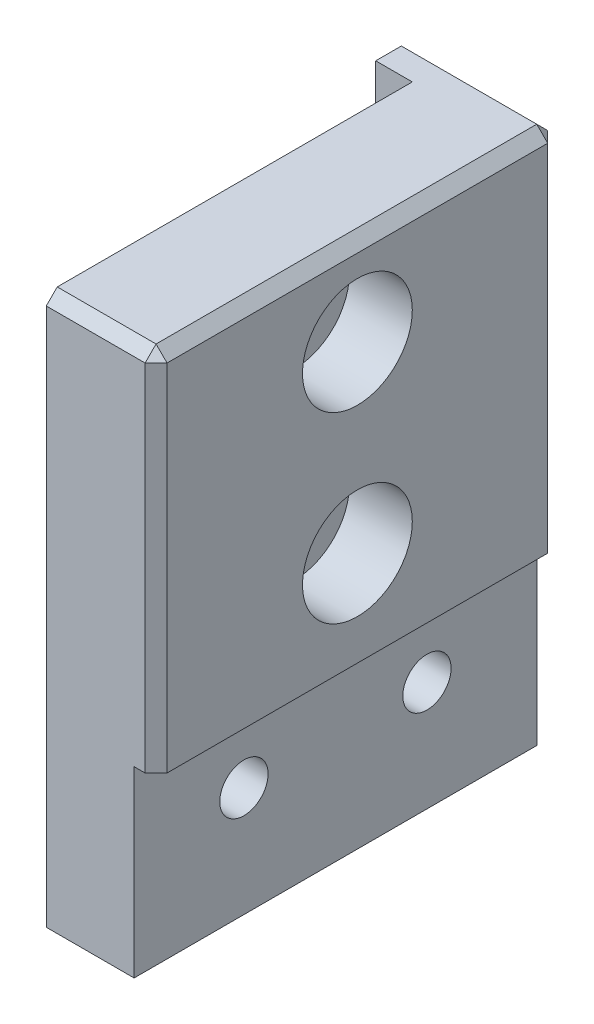
ISO-10303-21;
HEADER;
FILE_DESCRIPTION(('STEP AP214'),'2;1');
FILE_NAME('part.step','',(''),(''),'','','');
FILE_SCHEMA(('AUTOMOTIVE_DESIGN { 1 0 10303 214 1 1 1 1 }'));
ENDSEC;
DATA;
#1=APPLICATION_CONTEXT('core data for automotive mechanical design processes');
#2=APPLICATION_PROTOCOL_DEFINITION('international standard','automotive_design',2000,#1);
#3=PRODUCT_CONTEXT('',#1,'mechanical');
#4=PRODUCT('Part','Part','',(#3));
#5=PRODUCT_RELATED_PRODUCT_CATEGORY('part','',(#4));
#6=PRODUCT_DEFINITION_FORMATION('','',#4);
#7=PRODUCT_DEFINITION_CONTEXT('part definition',#1,'design');
#8=PRODUCT_DEFINITION('design','',#6,#7);
#9=PRODUCT_DEFINITION_SHAPE('','',#8);
#10=(LENGTH_UNIT() NAMED_UNIT(*) SI_UNIT(.MILLI.,.METRE.));
#11=(NAMED_UNIT(*) PLANE_ANGLE_UNIT() SI_UNIT($,.RADIAN.));
#12=(NAMED_UNIT(*) SI_UNIT($,.STERADIAN.) SOLID_ANGLE_UNIT());
#13=UNCERTAINTY_MEASURE_WITH_UNIT(LENGTH_MEASURE(1.E-05),#10,'distance_accuracy_value','');
#14=(GEOMETRIC_REPRESENTATION_CONTEXT(3) GLOBAL_UNCERTAINTY_ASSIGNED_CONTEXT((#13)) GLOBAL_UNIT_ASSIGNED_CONTEXT((#10,
#11,#12)) REPRESENTATION_CONTEXT('',''));
#15=CARTESIAN_POINT('',(0.,0.,0.));
#16=DIRECTION('',(0.,0.,1.));
#17=DIRECTION('',(1.,0.,0.));
#18=AXIS2_PLACEMENT_3D('',#15,#16,#17);
#19=CARTESIAN_POINT('',(0.,10.,40.));
#20=DIRECTION('',(-1.,0.,0.));
#21=DIRECTION('',(0.,0.,1.));
#22=AXIS2_PLACEMENT_3D('',#19,#20,#21);
#23=CYLINDRICAL_SURFACE('',#22,3.3);
#24=CARTESIAN_POINT('',(6.4,10.,40.));
#25=DIRECTION('',(-1.,0.,0.));
#26=DIRECTION('',(0.,0.,1.));
#27=AXIS2_PLACEMENT_3D('',#24,#25,#26);
#28=CIRCLE('',#27,3.3);
#29=CARTESIAN_POINT('',(6.4,10.,43.3));
#30=VERTEX_POINT('',#29);
#31=EDGE_CURVE('E301',#30,#30,#28,.T.);
#32=ORIENTED_EDGE('',*,*,#31,.T.);
#33=EDGE_LOOP('',(#32));
#34=FACE_BOUND('',#33,.T.);
#35=CARTESIAN_POINT('',(12.,10.,40.));
#36=DIRECTION('',(1.,0.,0.));
#37=DIRECTION('',(0.,0.,-1.));
#38=AXIS2_PLACEMENT_3D('',#35,#36,#37);
#39=CIRCLE('',#38,3.3);
#40=CARTESIAN_POINT('',(12.,10.,36.7));
#41=VERTEX_POINT('',#40);
#42=EDGE_CURVE('E183',#41,#41,#39,.F.);
#43=ORIENTED_EDGE('',*,*,#42,.F.);
#44=EDGE_LOOP('',(#43));
#45=FACE_BOUND('',#44,.T.);
#46=ADVANCED_FACE('F42',(#34,#45),#23,.F.);
#47=CARTESIAN_POINT('',(0.,10.,15.));
#48=DIRECTION('',(-1.,0.,0.));
#49=DIRECTION('',(0.,0.,1.));
#50=AXIS2_PLACEMENT_3D('',#47,#48,#49);
#51=CYLINDRICAL_SURFACE('',#50,3.3);
#52=CARTESIAN_POINT('',(6.4,10.,15.));
#53=DIRECTION('',(-1.,0.,0.));
#54=DIRECTION('',(0.,0.,1.));
#55=AXIS2_PLACEMENT_3D('',#52,#53,#54);
#56=CIRCLE('',#55,3.3);
#57=CARTESIAN_POINT('',(6.4,10.,18.3));
#58=VERTEX_POINT('',#57);
#59=EDGE_CURVE('E292',#58,#58,#56,.T.);
#60=ORIENTED_EDGE('',*,*,#59,.T.);
#61=EDGE_LOOP('',(#60));
#62=FACE_BOUND('',#61,.T.);
#63=CARTESIAN_POINT('',(12.,10.,15.));
#64=DIRECTION('',(1.,0.,0.));
#65=DIRECTION('',(0.,0.,-1.));
#66=AXIS2_PLACEMENT_3D('',#63,#64,#65);
#67=CIRCLE('',#66,3.3);
#68=CARTESIAN_POINT('',(12.,10.,11.7));
#69=VERTEX_POINT('',#68);
#70=EDGE_CURVE('E180',#69,#69,#67,.F.);
#71=ORIENTED_EDGE('',*,*,#70,.F.);
#72=EDGE_LOOP('',(#71));
#73=FACE_BOUND('',#72,.T.);
#74=ADVANCED_FACE('F326',(#62,#73),#51,.F.);
#75=CARTESIAN_POINT('',(0.,0.,55.));
#76=DIRECTION('',(1.,0.,0.));
#77=DIRECTION('',(0.,0.,-1.));
#78=AXIS2_PLACEMENT_3D('',#75,#76,#77);
#79=PLANE('',#78);
#80=CARTESIAN_POINT('',(0.,58.,27.5));
#81=DIRECTION('',(1.,0.,0.));
#82=DIRECTION('',(0.,0.,-1.));
#83=AXIS2_PLACEMENT_3D('',#80,#81,#82);
#84=CIRCLE('',#83,4.5);
#85=CARTESIAN_POINT('',(0.,58.,23.));
#86=VERTEX_POINT('',#85);
#87=EDGE_CURVE('E189',#86,#86,#84,.T.);
#88=ORIENTED_EDGE('',*,*,#87,.T.);
#89=EDGE_LOOP('',(#88));
#90=FACE_BOUND('',#89,.T.);
#91=CARTESIAN_POINT('',(0.,33.,27.5));
#92=DIRECTION('',(1.,0.,0.));
#93=DIRECTION('',(0.,0.,-1.));
#94=AXIS2_PLACEMENT_3D('',#91,#92,#93);
#95=CIRCLE('',#94,4.5);
#96=CARTESIAN_POINT('',(0.,33.,23.));
#97=VERTEX_POINT('',#96);
#98=EDGE_CURVE('E185',#97,#97,#95,.T.);
#99=ORIENTED_EDGE('',*,*,#98,.T.);
#100=EDGE_LOOP('',(#99));
#101=FACE_BOUND('',#100,.T.);
#102=CARTESIAN_POINT('',(0.,10.,15.));
#103=DIRECTION('',(-1.,0.,0.));
#104=DIRECTION('',(0.,0.,1.));
#105=AXIS2_PLACEMENT_3D('',#102,#103,#104);
#106=CIRCLE('',#105,5.5);
#107=CARTESIAN_POINT('',(0.,10.,20.5));
#108=VERTEX_POINT('',#107);
#109=EDGE_CURVE('E286',#108,#108,#106,.T.);
#110=ORIENTED_EDGE('',*,*,#109,.F.);
#111=EDGE_LOOP('',(#110));
#112=FACE_BOUND('',#111,.T.);
#113=CARTESIAN_POINT('',(0.,10.,40.));
#114=DIRECTION('',(-1.,0.,0.));
#115=DIRECTION('',(0.,0.,1.));
#116=AXIS2_PLACEMENT_3D('',#113,#114,#115);
#117=CIRCLE('',#116,5.5);
#118=CARTESIAN_POINT('',(0.,10.,45.5));
#119=VERTEX_POINT('',#118);
#120=EDGE_CURVE('E295',#119,#119,#117,.T.);
#121=ORIENTED_EDGE('',*,*,#120,.F.);
#122=EDGE_LOOP('',(#121));
#123=FACE_BOUND('',#122,.T.);
#124=DIRECTION('',(0.,-1.,0.));
#125=VECTOR('',#124,1.);
#126=CARTESIAN_POINT('',(0.,0.,55.));
#127=LINE('',#126,#125);
#128=CARTESIAN_POINT('',(0.,68.5,55.));
#129=VERTEX_POINT('',#128);
#130=CARTESIAN_POINT('',(0.,-5.,55.));
#131=VERTEX_POINT('',#130);
#132=EDGE_CURVE('E129',#129,#131,#127,.T.);
#133=ORIENTED_EDGE('',*,*,#132,.F.);
#134=DIRECTION('',(0.,-0.707106781186548,0.707106781186548));
#135=VECTOR('',#134,1.);
#136=CARTESIAN_POINT('',(0.,68.5,55.));
#137=LINE('',#136,#135);
#138=CARTESIAN_POINT('',(0.,70.,53.5));
#139=VERTEX_POINT('',#138);
#140=EDGE_CURVE('E11',#129,#139,#137,.F.);
#141=ORIENTED_EDGE('',*,*,#140,.T.);
#142=DIRECTION('',(0.,0.,-1.));
#143=VECTOR('',#142,1.);
#144=CARTESIAN_POINT('',(0.,70.,55.));
#145=LINE('',#144,#143);
#146=CARTESIAN_POINT('',(0.,70.,5.));
#147=VERTEX_POINT('',#146);
#148=EDGE_CURVE('E177',#139,#147,#145,.T.);
#149=ORIENTED_EDGE('',*,*,#148,.T.);
#150=DIRECTION('',(0.,1.,0.));
#151=VECTOR('',#150,1.);
#152=CARTESIAN_POINT('',(0.,70.,5.));
#153=LINE('',#152,#151);
#154=CARTESIAN_POINT('',(0.,-5.,5.));
#155=VERTEX_POINT('',#154);
#156=EDGE_CURVE('E143',#155,#147,#153,.T.);
#157=ORIENTED_EDGE('',*,*,#156,.F.);
#158=DIRECTION('',(0.,0.,-1.));
#159=VECTOR('',#158,1.);
#160=CARTESIAN_POINT('',(0.,-5.,50.));
#161=LINE('',#160,#159);
#162=EDGE_CURVE('E140',#131,#155,#161,.T.);
#163=ORIENTED_EDGE('',*,*,#162,.F.);
#164=EDGE_LOOP('',(#133,#141,#149,#157,#163));
#165=FACE_BOUND('',#164,.T.);
#166=ADVANCED_FACE('F141',(#90,#101,#112,#123,#165),#79,.F.);
#167=CARTESIAN_POINT('',(0.,70.,55.));
#168=DIRECTION('',(0.,-1.,0.));
#169=DIRECTION('',(0.,0.,-1.));
#170=AXIS2_PLACEMENT_3D('',#167,#168,#169);
#171=PLANE('',#170);
#172=DIRECTION('',(0.,0.,-1.));
#173=VECTOR('',#172,1.);
#174=CARTESIAN_POINT('',(13.5,70.,55.));
#175=LINE('',#174,#173);
#176=CARTESIAN_POINT('',(13.5,70.,53.5));
#177=VERTEX_POINT('',#176);
#178=CARTESIAN_POINT('',(13.5,70.,1.49999999999999));
#179=VERTEX_POINT('',#178);
#180=EDGE_CURVE('E195',#177,#179,#175,.T.);
#181=ORIENTED_EDGE('',*,*,#180,.T.);
#182=DIRECTION('',(-1.,0.,0.));
#183=VECTOR('',#182,1.);
#184=CARTESIAN_POINT('',(-5.,70.,1.49999999999999));
#185=LINE('',#184,#183);
#186=CARTESIAN_POINT('',(-5.,70.,1.49999999999999));
#187=VERTEX_POINT('',#186);
#188=EDGE_CURVE('E197',#179,#187,#185,.T.);
#189=ORIENTED_EDGE('',*,*,#188,.T.);
#190=DIRECTION('',(0.,0.,-1.));
#191=VECTOR('',#190,1.);
#192=CARTESIAN_POINT('',(-5.,70.,0.));
#193=LINE('',#192,#191);
#194=CARTESIAN_POINT('',(-5.,70.,5.));
#195=VERTEX_POINT('',#194);
#196=EDGE_CURVE('E170',#195,#187,#193,.T.);
#197=ORIENTED_EDGE('',*,*,#196,.F.);
#198=DIRECTION('',(1.,0.,0.));
#199=VECTOR('',#198,1.);
#200=CARTESIAN_POINT('',(-5.,70.,5.));
#201=LINE('',#200,#199);
#202=EDGE_CURVE('E173',#195,#147,#201,.T.);
#203=ORIENTED_EDGE('',*,*,#202,.T.);
#204=ORIENTED_EDGE('',*,*,#148,.F.);
#205=DIRECTION('',(1.,0.,0.));
#206=VECTOR('',#205,1.);
#207=CARTESIAN_POINT('',(0.,70.,53.5));
#208=LINE('',#207,#206);
#209=EDGE_CURVE('E179',#139,#177,#208,.T.);
#210=ORIENTED_EDGE('',*,*,#209,.T.);
#211=EDGE_LOOP('',(#181,#189,#197,#203,#204,#210));
#212=FACE_BOUND('',#211,.T.);
#213=ADVANCED_FACE('F247',(#212),#171,.F.);
#214=CARTESIAN_POINT('',(0.,0.,55.));
#215=DIRECTION('',(0.,0.,-1.));
#216=DIRECTION('',(-1.,0.,0.));
#217=AXIS2_PLACEMENT_3D('',#214,#215,#216);
#218=PLANE('',#217);
#219=DIRECTION('',(1.,0.,0.));
#220=VECTOR('',#219,1.);
#221=CARTESIAN_POINT('',(17.,20.,55.));
#222=LINE('',#221,#220);
#223=CARTESIAN_POINT('',(12.,20.,55.));
#224=VERTEX_POINT('',#223);
#225=CARTESIAN_POINT('',(13.5,20.,55.));
#226=VERTEX_POINT('',#225);
#227=EDGE_CURVE('E154',#224,#226,#222,.T.);
#228=ORIENTED_EDGE('',*,*,#227,.T.);
#229=DIRECTION('',(0.,1.,0.));
#230=VECTOR('',#229,1.);
#231=CARTESIAN_POINT('',(13.5,0.,55.));
#232=LINE('',#231,#230);
#233=CARTESIAN_POINT('',(13.5,68.5,55.));
#234=VERTEX_POINT('',#233);
#235=EDGE_CURVE('E52',#226,#234,#232,.T.);
#236=ORIENTED_EDGE('',*,*,#235,.T.);
#237=DIRECTION('',(-1.,0.,0.));
#238=VECTOR('',#237,1.);
#239=CARTESIAN_POINT('',(0.,68.5,55.));
#240=LINE('',#239,#238);
#241=EDGE_CURVE('E63',#234,#129,#240,.T.);
#242=ORIENTED_EDGE('',*,*,#241,.T.);
#243=ORIENTED_EDGE('',*,*,#132,.T.);
#244=DIRECTION('',(-1.,0.,0.));
#245=VECTOR('',#244,1.);
#246=CARTESIAN_POINT('',(20.,-5.,55.));
#247=LINE('',#246,#245);
#248=CARTESIAN_POINT('',(12.,-5.,55.));
#249=VERTEX_POINT('',#248);
#250=EDGE_CURVE('E134',#249,#131,#247,.T.);
#251=ORIENTED_EDGE('',*,*,#250,.F.);
#252=DIRECTION('',(0.,-1.,0.));
#253=VECTOR('',#252,1.);
#254=CARTESIAN_POINT('',(12.,20.,55.));
#255=LINE('',#254,#253);
#256=EDGE_CURVE('E271',#224,#249,#255,.T.);
#257=ORIENTED_EDGE('',*,*,#256,.F.);
#258=EDGE_LOOP('',(#228,#236,#242,#243,#251,#257));
#259=FACE_BOUND('',#258,.T.);
#260=ADVANCED_FACE('F131',(#259),#218,.F.);
#261=CARTESIAN_POINT('',(0.,0.,0.));
#262=DIRECTION('',(0.,0.,-1.));
#263=DIRECTION('',(-1.,0.,0.));
#264=AXIS2_PLACEMENT_3D('',#261,#262,#263);
#265=PLANE('',#264);
#266=DIRECTION('',(0.,-1.,0.));
#267=VECTOR('',#266,1.);
#268=CARTESIAN_POINT('',(-5.,70.,0.));
#269=LINE('',#268,#267);
#270=CARTESIAN_POINT('',(-5.,68.5,0.));
#271=VERTEX_POINT('',#270);
#272=CARTESIAN_POINT('',(-5.,-5.,0.));
#273=VERTEX_POINT('',#272);
#274=EDGE_CURVE('E166',#271,#273,#269,.T.);
#275=ORIENTED_EDGE('',*,*,#274,.F.);
#276=DIRECTION('',(1.,0.,0.));
#277=VECTOR('',#276,1.);
#278=CARTESIAN_POINT('',(15.,68.5,0.));
#279=LINE('',#278,#277);
#280=CARTESIAN_POINT('',(13.5,68.5,0.));
#281=VERTEX_POINT('',#280);
#282=EDGE_CURVE('E204',#271,#281,#279,.T.);
#283=ORIENTED_EDGE('',*,*,#282,.T.);
#284=DIRECTION('',(0.,-1.,0.));
#285=VECTOR('',#284,1.);
#286=CARTESIAN_POINT('',(13.5,20.,0.));
#287=LINE('',#286,#285);
#288=CARTESIAN_POINT('',(13.5,20.,0.));
#289=VERTEX_POINT('',#288);
#290=EDGE_CURVE('E202',#281,#289,#287,.T.);
#291=ORIENTED_EDGE('',*,*,#290,.T.);
#292=DIRECTION('',(1.,0.,0.));
#293=VECTOR('',#292,1.);
#294=CARTESIAN_POINT('',(17.,20.,0.));
#295=LINE('',#294,#293);
#296=CARTESIAN_POINT('',(12.,20.,0.));
#297=VERTEX_POINT('',#296);
#298=EDGE_CURVE('E156',#297,#289,#295,.T.);
#299=ORIENTED_EDGE('',*,*,#298,.F.);
#300=DIRECTION('',(0.,1.,0.));
#301=VECTOR('',#300,1.);
#302=CARTESIAN_POINT('',(12.,20.,0.));
#303=LINE('',#302,#301);
#304=CARTESIAN_POINT('',(12.,-5.,0.));
#305=VERTEX_POINT('',#304);
#306=EDGE_CURVE('E266',#305,#297,#303,.T.);
#307=ORIENTED_EDGE('',*,*,#306,.F.);
#308=DIRECTION('',(1.,0.,0.));
#309=VECTOR('',#308,1.);
#310=CARTESIAN_POINT('',(-5.,-5.,0.));
#311=LINE('',#310,#309);
#312=EDGE_CURVE('E164',#273,#305,#311,.T.);
#313=ORIENTED_EDGE('',*,*,#312,.F.);
#314=EDGE_LOOP('',(#275,#283,#291,#299,#307,#313));
#315=FACE_BOUND('',#314,.T.);
#316=ADVANCED_FACE('F263',(#315),#265,.T.);
#317=CARTESIAN_POINT('',(-5.,70.,5.));
#318=DIRECTION('',(0.,0.,-1.));
#319=DIRECTION('',(0.,1.,0.));
#320=AXIS2_PLACEMENT_3D('',#317,#318,#319);
#321=PLANE('',#320);
#322=ORIENTED_EDGE('',*,*,#156,.T.);
#323=ORIENTED_EDGE('',*,*,#202,.F.);
#324=DIRECTION('',(0.,1.,0.));
#325=VECTOR('',#324,1.);
#326=CARTESIAN_POINT('',(-5.,70.,5.));
#327=LINE('',#326,#325);
#328=CARTESIAN_POINT('',(-5.,-5.,5.));
#329=VERTEX_POINT('',#328);
#330=EDGE_CURVE('E168',#329,#195,#327,.T.);
#331=ORIENTED_EDGE('',*,*,#330,.F.);
#332=DIRECTION('',(-1.,0.,0.));
#333=VECTOR('',#332,1.);
#334=CARTESIAN_POINT('',(0.,-5.,5.));
#335=LINE('',#334,#333);
#336=EDGE_CURVE('E147',#155,#329,#335,.T.);
#337=ORIENTED_EDGE('',*,*,#336,.F.);
#338=EDGE_LOOP('',(#322,#323,#331,#337));
#339=FACE_BOUND('',#338,.T.);
#340=ADVANCED_FACE('F256',(#339),#321,.F.);
#341=CARTESIAN_POINT('',(-5.,0.,0.));
#342=DIRECTION('',(-1.,0.,0.));
#343=DIRECTION('',(0.,0.,1.));
#344=AXIS2_PLACEMENT_3D('',#341,#342,#343);
#345=PLANE('',#344);
#346=ORIENTED_EDGE('',*,*,#196,.T.);
#347=DIRECTION('',(0.,-0.707106781186548,-0.707106781186548));
#348=VECTOR('',#347,1.);
#349=CARTESIAN_POINT('',(-5.,34.25,-34.25));
#350=LINE('',#349,#348);
#351=EDGE_CURVE('E200',#187,#271,#350,.T.);
#352=ORIENTED_EDGE('',*,*,#351,.T.);
#353=ORIENTED_EDGE('',*,*,#274,.T.);
#354=DIRECTION('',(0.,0.,-1.));
#355=VECTOR('',#354,1.);
#356=CARTESIAN_POINT('',(-5.,-5.,5.));
#357=LINE('',#356,#355);
#358=EDGE_CURVE('E161',#329,#273,#357,.T.);
#359=ORIENTED_EDGE('',*,*,#358,.F.);
#360=ORIENTED_EDGE('',*,*,#330,.T.);
#361=EDGE_LOOP('',(#346,#352,#353,#359,#360));
#362=FACE_BOUND('',#361,.T.);
#363=ADVANCED_FACE('F258',(#362),#345,.T.);
#364=CARTESIAN_POINT('',(0.,-5.,0.));
#365=DIRECTION('',(0.,-1.,0.));
#366=DIRECTION('',(0.,0.,-1.));
#367=AXIS2_PLACEMENT_3D('',#364,#365,#366);
#368=PLANE('',#367);
#369=ORIENTED_EDGE('',*,*,#250,.T.);
#370=ORIENTED_EDGE('',*,*,#162,.T.);
#371=ORIENTED_EDGE('',*,*,#336,.T.);
#372=ORIENTED_EDGE('',*,*,#358,.T.);
#373=ORIENTED_EDGE('',*,*,#312,.T.);
#374=DIRECTION('',(0.,0.,1.));
#375=VECTOR('',#374,1.);
#376=CARTESIAN_POINT('',(12.,-5.,-155.));
#377=LINE('',#376,#375);
#378=EDGE_CURVE('E153',#305,#249,#377,.T.);
#379=ORIENTED_EDGE('',*,*,#378,.T.);
#380=EDGE_LOOP('',(#369,#370,#371,#372,#373,#379));
#381=FACE_BOUND('',#380,.T.);
#382=ADVANCED_FACE('F150',(#381),#368,.T.);
#383=CARTESIAN_POINT('',(17.,20.,55.));
#384=DIRECTION('',(0.,1.,0.));
#385=DIRECTION('',(0.,0.,1.));
#386=AXIS2_PLACEMENT_3D('',#383,#384,#385);
#387=PLANE('',#386);
#388=ORIENTED_EDGE('',*,*,#298,.T.);
#389=DIRECTION('',(0.707106781186548,0.,0.707106781186547));
#390=VECTOR('',#389,1.);
#391=CARTESIAN_POINT('',(15.,20.,1.49999999999999));
#392=LINE('',#391,#390);
#393=CARTESIAN_POINT('',(15.,20.,1.49999999999999));
#394=VERTEX_POINT('',#393);
#395=EDGE_CURVE('E214',#289,#394,#392,.T.);
#396=ORIENTED_EDGE('',*,*,#395,.T.);
#397=DIRECTION('',(0.,0.,1.));
#398=VECTOR('',#397,1.);
#399=CARTESIAN_POINT('',(15.,20.,55.));
#400=LINE('',#399,#398);
#401=CARTESIAN_POINT('',(15.,20.,53.5));
#402=VERTEX_POINT('',#401);
#403=EDGE_CURVE('E275',#394,#402,#400,.T.);
#404=ORIENTED_EDGE('',*,*,#403,.T.);
#405=DIRECTION('',(0.707106781186548,0.,-0.707106781186548));
#406=VECTOR('',#405,1.);
#407=CARTESIAN_POINT('',(13.5,20.,55.));
#408=LINE('',#407,#406);
#409=EDGE_CURVE('E212',#402,#226,#408,.F.);
#410=ORIENTED_EDGE('',*,*,#409,.T.);
#411=ORIENTED_EDGE('',*,*,#227,.F.);
#412=DIRECTION('',(0.,0.,1.));
#413=VECTOR('',#412,1.);
#414=CARTESIAN_POINT('',(12.,20.,55.));
#415=LINE('',#414,#413);
#416=EDGE_CURVE('E184',#297,#224,#415,.T.);
#417=ORIENTED_EDGE('',*,*,#416,.F.);
#418=EDGE_LOOP('',(#388,#396,#404,#410,#411,#417));
#419=FACE_BOUND('',#418,.T.);
#420=ADVANCED_FACE('F307',(#419),#387,.F.);
#421=CARTESIAN_POINT('',(6.4,13.3,40.));
#422=DIRECTION('',(1.,0.,0.));
#423=DIRECTION('',(0.,0.,-1.));
#424=AXIS2_PLACEMENT_3D('',#421,#422,#423);
#425=PLANE('',#424);
#426=ORIENTED_EDGE('',*,*,#31,.F.);
#427=EDGE_LOOP('',(#426));
#428=FACE_BOUND('',#427,.T.);
#429=CARTESIAN_POINT('',(6.4,10.,40.));
#430=DIRECTION('',(-1.,0.,0.));
#431=DIRECTION('',(0.,0.,1.));
#432=AXIS2_PLACEMENT_3D('',#429,#430,#431);
#433=CIRCLE('',#432,5.5);
#434=CARTESIAN_POINT('',(6.4,10.,45.5));
#435=VERTEX_POINT('',#434);
#436=EDGE_CURVE('E298',#435,#435,#433,.T.);
#437=ORIENTED_EDGE('',*,*,#436,.T.);
#438=EDGE_LOOP('',(#437));
#439=FACE_BOUND('',#438,.T.);
#440=ADVANCED_FACE('F336',(#428,#439),#425,.F.);
#441=CARTESIAN_POINT('',(0.,10.,40.));
#442=DIRECTION('',(-1.,0.,0.));
#443=DIRECTION('',(0.,0.,1.));
#444=AXIS2_PLACEMENT_3D('',#441,#442,#443);
#445=CYLINDRICAL_SURFACE('',#444,5.5);
#446=ORIENTED_EDGE('',*,*,#436,.F.);
#447=EDGE_LOOP('',(#446));
#448=FACE_BOUND('',#447,.T.);
#449=ORIENTED_EDGE('',*,*,#120,.T.);
#450=EDGE_LOOP('',(#449));
#451=FACE_BOUND('',#450,.T.);
#452=ADVANCED_FACE('F576',(#448,#451),#445,.F.);
#453=CARTESIAN_POINT('',(6.4,13.3,15.));
#454=DIRECTION('',(1.,0.,0.));
#455=DIRECTION('',(0.,0.,-1.));
#456=AXIS2_PLACEMENT_3D('',#453,#454,#455);
#457=PLANE('',#456);
#458=ORIENTED_EDGE('',*,*,#59,.F.);
#459=EDGE_LOOP('',(#458));
#460=FACE_BOUND('',#459,.T.);
#461=CARTESIAN_POINT('',(6.4,10.,15.));
#462=DIRECTION('',(-1.,0.,0.));
#463=DIRECTION('',(0.,0.,1.));
#464=AXIS2_PLACEMENT_3D('',#461,#462,#463);
#465=CIRCLE('',#464,5.5);
#466=CARTESIAN_POINT('',(6.4,10.,20.5));
#467=VERTEX_POINT('',#466);
#468=EDGE_CURVE('E289',#467,#467,#465,.T.);
#469=ORIENTED_EDGE('',*,*,#468,.T.);
#470=EDGE_LOOP('',(#469));
#471=FACE_BOUND('',#470,.T.);
#472=ADVANCED_FACE('F566',(#460,#471),#457,.F.);
#473=CARTESIAN_POINT('',(0.,10.,15.));
#474=DIRECTION('',(-1.,0.,0.));
#475=DIRECTION('',(0.,0.,1.));
#476=AXIS2_PLACEMENT_3D('',#473,#474,#475);
#477=CYLINDRICAL_SURFACE('',#476,5.5);
#478=ORIENTED_EDGE('',*,*,#468,.F.);
#479=EDGE_LOOP('',(#478));
#480=FACE_BOUND('',#479,.T.);
#481=ORIENTED_EDGE('',*,*,#109,.T.);
#482=EDGE_LOOP('',(#481));
#483=FACE_BOUND('',#482,.T.);
#484=ADVANCED_FACE('F498',(#480,#483),#477,.F.);
#485=CARTESIAN_POINT('',(12.,0.,0.));
#486=DIRECTION('',(1.,0.,0.));
#487=DIRECTION('',(0.,0.,-1.));
#488=AXIS2_PLACEMENT_3D('',#485,#486,#487);
#489=PLANE('',#488);
#490=ORIENTED_EDGE('',*,*,#256,.T.);
#491=ORIENTED_EDGE('',*,*,#378,.F.);
#492=ORIENTED_EDGE('',*,*,#306,.T.);
#493=ORIENTED_EDGE('',*,*,#416,.T.);
#494=EDGE_LOOP('',(#490,#491,#492,#493));
#495=FACE_BOUND('',#494,.T.);
#496=ORIENTED_EDGE('',*,*,#70,.T.);
#497=EDGE_LOOP('',(#496));
#498=FACE_BOUND('',#497,.T.);
#499=ORIENTED_EDGE('',*,*,#42,.T.);
#500=EDGE_LOOP('',(#499));
#501=FACE_BOUND('',#500,.T.);
#502=ADVANCED_FACE('F273',(#495,#498,#501),#489,.T.);
#503=CARTESIAN_POINT('',(15.,-140.,0.));
#504=DIRECTION('',(-1.,0.,0.));
#505=DIRECTION('',(0.,0.,1.));
#506=AXIS2_PLACEMENT_3D('',#503,#504,#505);
#507=PLANE('',#506);
#508=CARTESIAN_POINT('',(15.,58.,27.5));
#509=DIRECTION('',(1.,0.,0.));
#510=DIRECTION('',(0.,0.,-1.));
#511=AXIS2_PLACEMENT_3D('',#508,#509,#510);
#512=CIRCLE('',#511,7.49999999999999);
#513=CARTESIAN_POINT('',(15.,58.,20.));
#514=VERTEX_POINT('',#513);
#515=EDGE_CURVE('E137',#514,#514,#512,.T.);
#516=ORIENTED_EDGE('',*,*,#515,.F.);
#517=EDGE_LOOP('',(#516));
#518=FACE_BOUND('',#517,.T.);
#519=CARTESIAN_POINT('',(15.,33.,27.5));
#520=DIRECTION('',(1.,0.,0.));
#521=DIRECTION('',(0.,0.,-1.));
#522=AXIS2_PLACEMENT_3D('',#519,#520,#521);
#523=CIRCLE('',#522,7.5);
#524=CARTESIAN_POINT('',(15.,33.,20.));
#525=VERTEX_POINT('',#524);
#526=EDGE_CURVE('E192',#525,#525,#523,.T.);
#527=ORIENTED_EDGE('',*,*,#526,.F.);
#528=EDGE_LOOP('',(#527));
#529=FACE_BOUND('',#528,.T.);
#530=ORIENTED_EDGE('',*,*,#403,.F.);
#531=DIRECTION('',(0.,1.,0.));
#532=VECTOR('',#531,1.);
#533=CARTESIAN_POINT('',(15.,70.,1.49999999999999));
#534=LINE('',#533,#532);
#535=CARTESIAN_POINT('',(15.,68.5,1.49999999999999));
#536=VERTEX_POINT('',#535);
#537=EDGE_CURVE('E210',#394,#536,#534,.T.);
#538=ORIENTED_EDGE('',*,*,#537,.T.);
#539=DIRECTION('',(0.,0.,1.));
#540=VECTOR('',#539,1.);
#541=CARTESIAN_POINT('',(15.,68.5,0.));
#542=LINE('',#541,#540);
#543=CARTESIAN_POINT('',(15.,68.5,53.5));
#544=VERTEX_POINT('',#543);
#545=EDGE_CURVE('E208',#536,#544,#542,.T.);
#546=ORIENTED_EDGE('',*,*,#545,.T.);
#547=DIRECTION('',(0.,-1.,0.));
#548=VECTOR('',#547,1.);
#549=CARTESIAN_POINT('',(15.,-140.,53.5));
#550=LINE('',#549,#548);
#551=EDGE_CURVE('E206',#544,#402,#550,.T.);
#552=ORIENTED_EDGE('',*,*,#551,.T.);
#553=EDGE_LOOP('',(#530,#538,#546,#552));
#554=FACE_BOUND('',#553,.T.);
#555=ADVANCED_FACE('F314',(#518,#529,#554),#507,.F.);
#556=CARTESIAN_POINT('',(15.,33.,27.5));
#557=DIRECTION('',(1.,0.,0.));
#558=DIRECTION('',(0.,0.,-1.));
#559=AXIS2_PLACEMENT_3D('',#556,#557,#558);
#560=CYLINDRICAL_SURFACE('',#559,4.5);
#561=CARTESIAN_POINT('',(6.4,33.,27.5));
#562=DIRECTION('',(1.,0.,0.));
#563=DIRECTION('',(0.,0.,-1.));
#564=AXIS2_PLACEMENT_3D('',#561,#562,#563);
#565=CIRCLE('',#564,4.5);
#566=CARTESIAN_POINT('',(6.4,33.,23.));
#567=VERTEX_POINT('',#566);
#568=EDGE_CURVE('E188',#567,#567,#565,.T.);
#569=ORIENTED_EDGE('',*,*,#568,.T.);
#570=EDGE_LOOP('',(#569));
#571=FACE_BOUND('',#570,.T.);
#572=ORIENTED_EDGE('',*,*,#98,.F.);
#573=EDGE_LOOP('',(#572));
#574=FACE_BOUND('',#573,.T.);
#575=ADVANCED_FACE('F480',(#571,#574),#560,.F.);
#576=CARTESIAN_POINT('',(6.4,37.5,27.5));
#577=DIRECTION('',(-1.,0.,0.));
#578=DIRECTION('',(0.,0.,1.));
#579=AXIS2_PLACEMENT_3D('',#576,#577,#578);
#580=PLANE('',#579);
#581=ORIENTED_EDGE('',*,*,#568,.F.);
#582=EDGE_LOOP('',(#581));
#583=FACE_BOUND('',#582,.T.);
#584=CARTESIAN_POINT('',(6.4,33.,27.5));
#585=DIRECTION('',(1.,0.,0.));
#586=DIRECTION('',(0.,0.,-1.));
#587=AXIS2_PLACEMENT_3D('',#584,#585,#586);
#588=CIRCLE('',#587,7.5);
#589=CARTESIAN_POINT('',(6.4,33.,20.));
#590=VERTEX_POINT('',#589);
#591=EDGE_CURVE('E663',#590,#590,#588,.T.);
#592=ORIENTED_EDGE('',*,*,#591,.T.);
#593=EDGE_LOOP('',(#592));
#594=FACE_BOUND('',#593,.T.);
#595=ADVANCED_FACE('F471',(#583,#594),#580,.F.);
#596=CARTESIAN_POINT('',(15.,33.,27.5));
#597=DIRECTION('',(1.,0.,0.));
#598=DIRECTION('',(0.,0.,-1.));
#599=AXIS2_PLACEMENT_3D('',#596,#597,#598);
#600=CYLINDRICAL_SURFACE('',#599,7.5);
#601=ORIENTED_EDGE('',*,*,#591,.F.);
#602=EDGE_LOOP('',(#601));
#603=FACE_BOUND('',#602,.T.);
#604=ORIENTED_EDGE('',*,*,#526,.T.);
#605=EDGE_LOOP('',(#604));
#606=FACE_BOUND('',#605,.T.);
#607=ADVANCED_FACE('F462',(#603,#606),#600,.F.);
#608=CARTESIAN_POINT('',(15.,58.,27.5));
#609=DIRECTION('',(1.,0.,0.));
#610=DIRECTION('',(0.,0.,-1.));
#611=AXIS2_PLACEMENT_3D('',#608,#609,#610);
#612=CYLINDRICAL_SURFACE('',#611,4.5);
#613=CARTESIAN_POINT('',(6.4,58.,27.5));
#614=DIRECTION('',(1.,0.,0.));
#615=DIRECTION('',(0.,0.,-1.));
#616=AXIS2_PLACEMENT_3D('',#613,#614,#615);
#617=CIRCLE('',#616,4.5);
#618=CARTESIAN_POINT('',(6.4,58.,23.));
#619=VERTEX_POINT('',#618);
#620=EDGE_CURVE('E193',#619,#619,#617,.T.);
#621=ORIENTED_EDGE('',*,*,#620,.T.);
#622=EDGE_LOOP('',(#621));
#623=FACE_BOUND('',#622,.T.);
#624=ORIENTED_EDGE('',*,*,#87,.F.);
#625=EDGE_LOOP('',(#624));
#626=FACE_BOUND('',#625,.T.);
#627=ADVANCED_FACE('F453',(#623,#626),#612,.F.);
#628=CARTESIAN_POINT('',(6.4,62.5,27.5));
#629=DIRECTION('',(-1.,0.,0.));
#630=DIRECTION('',(0.,0.,1.));
#631=AXIS2_PLACEMENT_3D('',#628,#629,#630);
#632=PLANE('',#631);
#633=ORIENTED_EDGE('',*,*,#620,.F.);
#634=EDGE_LOOP('',(#633));
#635=FACE_BOUND('',#634,.T.);
#636=CARTESIAN_POINT('',(6.4,58.,27.5));
#637=DIRECTION('',(1.,0.,0.));
#638=DIRECTION('',(0.,0.,-1.));
#639=AXIS2_PLACEMENT_3D('',#636,#637,#638);
#640=CIRCLE('',#639,7.49999999999999);
#641=CARTESIAN_POINT('',(6.4,58.,20.));
#642=VERTEX_POINT('',#641);
#643=EDGE_CURVE('E669',#642,#642,#640,.T.);
#644=ORIENTED_EDGE('',*,*,#643,.T.);
#645=EDGE_LOOP('',(#644));
#646=FACE_BOUND('',#645,.T.);
#647=ADVANCED_FACE('F322',(#635,#646),#632,.F.);
#648=CARTESIAN_POINT('',(15.,58.,27.5));
#649=DIRECTION('',(1.,0.,0.));
#650=DIRECTION('',(0.,0.,-1.));
#651=AXIS2_PLACEMENT_3D('',#648,#649,#650);
#652=CYLINDRICAL_SURFACE('',#651,7.49999999999999);
#653=ORIENTED_EDGE('',*,*,#643,.F.);
#654=EDGE_LOOP('',(#653));
#655=FACE_BOUND('',#654,.T.);
#656=ORIENTED_EDGE('',*,*,#515,.T.);
#657=EDGE_LOOP('',(#656));
#658=FACE_BOUND('',#657,.T.);
#659=ADVANCED_FACE('F317',(#655,#658),#652,.F.);
#660=CARTESIAN_POINT('',(13.5,0.,55.));
#661=DIRECTION('',(-0.707106781186548,0.,-0.707106781186548));
#662=DIRECTION('',(0.,1.,0.));
#663=AXIS2_PLACEMENT_3D('',#660,#661,#662);
#664=PLANE('',#663);
#665=ORIENTED_EDGE('',*,*,#409,.F.);
#666=ORIENTED_EDGE('',*,*,#551,.F.);
#667=DIRECTION('',(-0.707106781186548,0.,0.707106781186548));
#668=VECTOR('',#667,1.);
#669=CARTESIAN_POINT('',(15.,68.5,53.5));
#670=LINE('',#669,#668);
#671=EDGE_CURVE('E47',#234,#544,#670,.F.);
#672=ORIENTED_EDGE('',*,*,#671,.F.);
#673=ORIENTED_EDGE('',*,*,#235,.F.);
#674=EDGE_LOOP('',(#665,#666,#672,#673));
#675=FACE_BOUND('',#674,.T.);
#676=ADVANCED_FACE('F45',(#675),#664,.F.);
#677=CARTESIAN_POINT('',(0.,68.5,55.));
#678=DIRECTION('',(0.,-0.707106781186548,-0.707106781186548));
#679=DIRECTION('',(-1.,0.,0.));
#680=AXIS2_PLACEMENT_3D('',#677,#678,#679);
#681=PLANE('',#680);
#682=ORIENTED_EDGE('',*,*,#140,.F.);
#683=ORIENTED_EDGE('',*,*,#241,.F.);
#684=DIRECTION('',(0.,0.707106781186548,-0.707106781186548));
#685=VECTOR('',#684,1.);
#686=CARTESIAN_POINT('',(13.5,69.25,54.25));
#687=LINE('',#686,#685);
#688=EDGE_CURVE('E229',#177,#234,#687,.F.);
#689=ORIENTED_EDGE('',*,*,#688,.F.);
#690=ORIENTED_EDGE('',*,*,#209,.F.);
#691=EDGE_LOOP('',(#682,#683,#689,#690));
#692=FACE_BOUND('',#691,.T.);
#693=ADVANCED_FACE('F253',(#692),#681,.F.);
#694=CARTESIAN_POINT('',(15.,68.5,53.5));
#695=DIRECTION('',(0.577350269189629,0.577350269189624,0.577350269189624));
#696=DIRECTION('',(0.707106781186544,0.,-0.707106781186551));
#697=AXIS2_PLACEMENT_3D('',#694,#695,#696);
#698=PLANE('',#697);
#699=ORIENTED_EDGE('',*,*,#688,.T.);
#700=ORIENTED_EDGE('',*,*,#671,.T.);
#701=DIRECTION('',(0.707106781186544,-0.707106781186551,0.));
#702=VECTOR('',#701,1.);
#703=CARTESIAN_POINT('',(15.,68.5,53.5));
#704=LINE('',#703,#702);
#705=EDGE_CURVE('E227',#177,#544,#704,.T.);
#706=ORIENTED_EDGE('',*,*,#705,.F.);
#707=EDGE_LOOP('',(#699,#700,#706));
#708=FACE_BOUND('',#707,.T.);
#709=ADVANCED_FACE('F236',(#708),#698,.T.);
#710=CARTESIAN_POINT('',(15.,-140.,1.49999999999999));
#711=DIRECTION('',(0.707106781186547,0.,-0.707106781186548));
#712=DIRECTION('',(0.,-1.,0.));
#713=AXIS2_PLACEMENT_3D('',#710,#711,#712);
#714=PLANE('',#713);
#715=ORIENTED_EDGE('',*,*,#395,.F.);
#716=ORIENTED_EDGE('',*,*,#290,.F.);
#717=DIRECTION('',(-0.707106781186548,0.,-0.707106781186547));
#718=VECTOR('',#717,1.);
#719=CARTESIAN_POINT('',(13.5,68.5,0.));
#720=LINE('',#719,#718);
#721=EDGE_CURVE('E224',#536,#281,#720,.T.);
#722=ORIENTED_EDGE('',*,*,#721,.F.);
#723=ORIENTED_EDGE('',*,*,#537,.F.);
#724=EDGE_LOOP('',(#715,#716,#722,#723));
#725=FACE_BOUND('',#724,.T.);
#726=ADVANCED_FACE('F312',(#725),#714,.T.);
#727=CARTESIAN_POINT('',(15.,68.5,0.));
#728=DIRECTION('',(-0.707106781186551,-0.707106781186544,0.));
#729=DIRECTION('',(0.,0.,1.));
#730=AXIS2_PLACEMENT_3D('',#727,#728,#729);
#731=PLANE('',#730);
#732=ORIENTED_EDGE('',*,*,#705,.T.);
#733=ORIENTED_EDGE('',*,*,#545,.F.);
#734=DIRECTION('',(-0.707106781186544,0.707106781186551,0.));
#735=VECTOR('',#734,1.);
#736=CARTESIAN_POINT('',(14.25,69.25,1.49999999999999));
#737=LINE('',#736,#735);
#738=EDGE_CURVE('E221',#179,#536,#737,.F.);
#739=ORIENTED_EDGE('',*,*,#738,.F.);
#740=ORIENTED_EDGE('',*,*,#180,.F.);
#741=EDGE_LOOP('',(#732,#733,#739,#740));
#742=FACE_BOUND('',#741,.T.);
#743=ADVANCED_FACE('F242',(#742),#731,.F.);
#744=CARTESIAN_POINT('',(13.5,68.5,0.));
#745=DIRECTION('',(0.577350269189629,0.577350269189624,-0.577350269189624));
#746=DIRECTION('',(-0.707106781186544,0.,-0.707106781186551));
#747=AXIS2_PLACEMENT_3D('',#744,#745,#746);
#748=PLANE('',#747);
#749=ORIENTED_EDGE('',*,*,#738,.T.);
#750=ORIENTED_EDGE('',*,*,#721,.T.);
#751=DIRECTION('',(0.,0.707106781186548,0.707106781186548));
#752=VECTOR('',#751,1.);
#753=CARTESIAN_POINT('',(13.5,68.5,0.));
#754=LINE('',#753,#752);
#755=EDGE_CURVE('E218',#179,#281,#754,.F.);
#756=ORIENTED_EDGE('',*,*,#755,.F.);
#757=EDGE_LOOP('',(#749,#750,#756));
#758=FACE_BOUND('',#757,.T.);
#759=ADVANCED_FACE('F362',(#758),#748,.T.);
#760=CARTESIAN_POINT('',(0.,70.,1.49999999999999));
#761=DIRECTION('',(0.,0.707106781186548,-0.707106781186548));
#762=DIRECTION('',(1.,0.,0.));
#763=AXIS2_PLACEMENT_3D('',#760,#761,#762);
#764=PLANE('',#763);
#765=ORIENTED_EDGE('',*,*,#755,.T.);
#766=ORIENTED_EDGE('',*,*,#282,.F.);
#767=ORIENTED_EDGE('',*,*,#351,.F.);
#768=ORIENTED_EDGE('',*,*,#188,.F.);
#769=EDGE_LOOP('',(#765,#766,#767,#768));
#770=FACE_BOUND('',#769,.T.);
#771=ADVANCED_FACE('F356',(#770),#764,.T.);
#772=CLOSED_SHELL('',(#46,#74,#166,#213,#260,#316,#340,#363,#382,#420,#440,#452,#472,#484,#502,
#555,#575,#595,#607,#627,#647,#659,#676,#693,#709,#726,#743,#759,#771));
#773=MANIFOLD_SOLID_BREP('B2',#772);
#774=ADVANCED_BREP_SHAPE_REPRESENTATION('',(#18,#773),#14);
#775=SHAPE_DEFINITION_REPRESENTATION(#9,#774);
ENDSEC;
END-ISO-10303-21;
